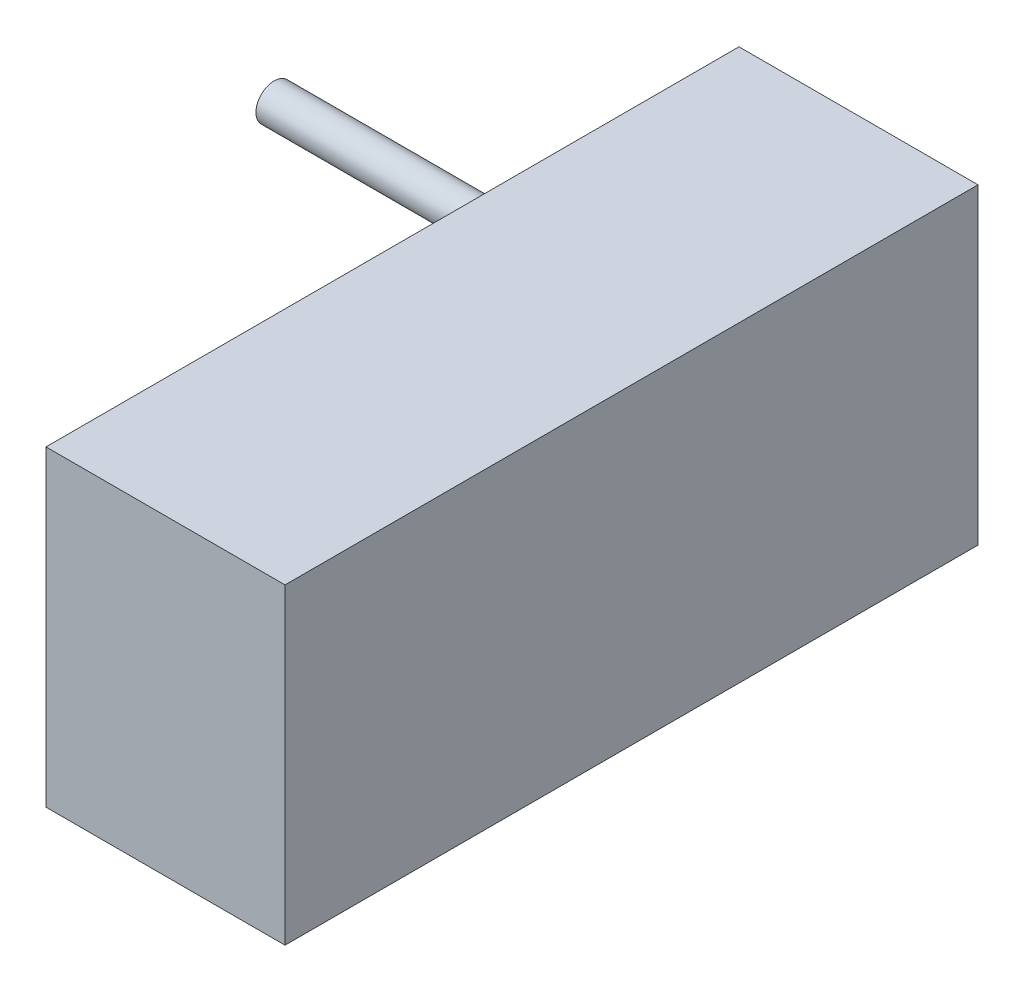
ISO-10303-21;
HEADER;
FILE_DESCRIPTION(('STEP AP214'),'2;1');
FILE_NAME('part.step','',(''),(''),'','','');
FILE_SCHEMA(('AUTOMOTIVE_DESIGN { 1 0 10303 214 1 1 1 1 }'));
ENDSEC;
DATA;
#1=APPLICATION_CONTEXT('core data for automotive mechanical design processes');
#2=APPLICATION_PROTOCOL_DEFINITION('international standard','automotive_design',2000,#1);
#3=PRODUCT_CONTEXT('',#1,'mechanical');
#4=PRODUCT('Part','Part','',(#3));
#5=PRODUCT_RELATED_PRODUCT_CATEGORY('part','',(#4));
#6=PRODUCT_DEFINITION_FORMATION('','',#4);
#7=PRODUCT_DEFINITION_CONTEXT('part definition',#1,'design');
#8=PRODUCT_DEFINITION('design','',#6,#7);
#9=PRODUCT_DEFINITION_SHAPE('','',#8);
#10=(LENGTH_UNIT() NAMED_UNIT(*) SI_UNIT(.MILLI.,.METRE.));
#11=(NAMED_UNIT(*) PLANE_ANGLE_UNIT() SI_UNIT($,.RADIAN.));
#12=(NAMED_UNIT(*) SI_UNIT($,.STERADIAN.) SOLID_ANGLE_UNIT());
#13=UNCERTAINTY_MEASURE_WITH_UNIT(LENGTH_MEASURE(1.E-05),#10,'distance_accuracy_value','');
#14=(GEOMETRIC_REPRESENTATION_CONTEXT(3) GLOBAL_UNCERTAINTY_ASSIGNED_CONTEXT((#13)) GLOBAL_UNIT_ASSIGNED_CONTEXT((#10,
#11,#12)) REPRESENTATION_CONTEXT('',''));
#15=CARTESIAN_POINT('',(0.,0.,0.));
#16=DIRECTION('',(0.,0.,1.));
#17=DIRECTION('',(1.,0.,0.));
#18=AXIS2_PLACEMENT_3D('',#15,#16,#17);
#19=CARTESIAN_POINT('',(0.,25.,0.));
#20=DIRECTION('',(0.,0.,-1.));
#21=DIRECTION('',(-1.,0.,0.));
#22=AXIS2_PLACEMENT_3D('',#19,#20,#21);
#23=PLANE('',#22);
#24=DIRECTION('',(1.,0.,0.));
#25=VECTOR('',#24,1.);
#26=CARTESIAN_POINT('',(0.,0.,0.));
#27=LINE('',#26,#25);
#28=CARTESIAN_POINT('',(0.,0.,0.));
#29=VERTEX_POINT('',#28);
#30=CARTESIAN_POINT('',(19.15,0.,0.));
#31=VERTEX_POINT('',#30);
#32=EDGE_CURVE('E103',#29,#31,#27,.T.);
#33=ORIENTED_EDGE('',*,*,#32,.T.);
#34=DIRECTION('',(0.,-1.,0.));
#35=VECTOR('',#34,1.);
#36=CARTESIAN_POINT('',(19.15,25.,0.));
#37=LINE('',#36,#35);
#38=CARTESIAN_POINT('',(19.15,25.,0.));
#39=VERTEX_POINT('',#38);
#40=EDGE_CURVE('E45',#39,#31,#37,.T.);
#41=ORIENTED_EDGE('',*,*,#40,.F.);
#42=DIRECTION('',(1.,0.,0.));
#43=VECTOR('',#42,1.);
#44=CARTESIAN_POINT('',(0.,25.,0.));
#45=LINE('',#44,#43);
#46=CARTESIAN_POINT('',(0.,25.,0.));
#47=VERTEX_POINT('',#46);
#48=EDGE_CURVE('E78',#47,#39,#45,.T.);
#49=ORIENTED_EDGE('',*,*,#48,.F.);
#50=DIRECTION('',(0.,-1.,0.));
#51=VECTOR('',#50,1.);
#52=CARTESIAN_POINT('',(0.,25.,0.));
#53=LINE('',#52,#51);
#54=EDGE_CURVE('E53',#47,#29,#53,.T.);
#55=ORIENTED_EDGE('',*,*,#54,.T.);
#56=EDGE_LOOP('',(#33,#41,#49,#55));
#57=FACE_BOUND('',#56,.T.);
#58=ADVANCED_FACE('F37',(#57),#23,.F.);
#59=CARTESIAN_POINT('',(19.15,25.,-55.52));
#60=DIRECTION('',(1.,0.,0.));
#61=DIRECTION('',(0.,0.,-1.));
#62=AXIS2_PLACEMENT_3D('',#59,#60,#61);
#63=PLANE('',#62);
#64=DIRECTION('',(0.,0.,1.));
#65=VECTOR('',#64,1.);
#66=CARTESIAN_POINT('',(19.15,0.,-55.52));
#67=LINE('',#66,#65);
#68=CARTESIAN_POINT('',(19.15,0.,-55.52));
#69=VERTEX_POINT('',#68);
#70=EDGE_CURVE('E88',#69,#31,#67,.T.);
#71=ORIENTED_EDGE('',*,*,#70,.F.);
#72=DIRECTION('',(0.,-1.,0.));
#73=VECTOR('',#72,1.);
#74=CARTESIAN_POINT('',(19.15,25.,-55.52));
#75=LINE('',#74,#73);
#76=CARTESIAN_POINT('',(19.15,25.,-55.52));
#77=VERTEX_POINT('',#76);
#78=EDGE_CURVE('E84',#77,#69,#75,.T.);
#79=ORIENTED_EDGE('',*,*,#78,.F.);
#80=DIRECTION('',(0.,0.,1.));
#81=VECTOR('',#80,1.);
#82=CARTESIAN_POINT('',(19.15,25.,-55.52));
#83=LINE('',#82,#81);
#84=EDGE_CURVE('E86',#77,#39,#83,.T.);
#85=ORIENTED_EDGE('',*,*,#84,.T.);
#86=ORIENTED_EDGE('',*,*,#40,.T.);
#87=EDGE_LOOP('',(#71,#79,#85,#86));
#88=FACE_BOUND('',#87,.T.);
#89=ADVANCED_FACE('F85',(#88),#63,.T.);
#90=CARTESIAN_POINT('',(0.,25.,-55.52));
#91=DIRECTION('',(0.,0.,-1.));
#92=DIRECTION('',(-1.,0.,0.));
#93=AXIS2_PLACEMENT_3D('',#90,#91,#92);
#94=PLANE('',#93);
#95=DIRECTION('',(1.,0.,0.));
#96=VECTOR('',#95,1.);
#97=CARTESIAN_POINT('',(0.,0.,-55.52));
#98=LINE('',#97,#96);
#99=CARTESIAN_POINT('',(0.,0.,-55.52));
#100=VERTEX_POINT('',#99);
#101=EDGE_CURVE('E107',#100,#69,#98,.T.);
#102=ORIENTED_EDGE('',*,*,#101,.F.);
#103=DIRECTION('',(0.,-1.,0.));
#104=VECTOR('',#103,1.);
#105=CARTESIAN_POINT('',(0.,25.,-55.52));
#106=LINE('',#105,#104);
#107=CARTESIAN_POINT('',(0.,25.,-55.52));
#108=VERTEX_POINT('',#107);
#109=EDGE_CURVE('E67',#108,#100,#106,.T.);
#110=ORIENTED_EDGE('',*,*,#109,.F.);
#111=DIRECTION('',(1.,0.,0.));
#112=VECTOR('',#111,1.);
#113=CARTESIAN_POINT('',(0.,25.,-55.52));
#114=LINE('',#113,#112);
#115=EDGE_CURVE('E95',#108,#77,#114,.T.);
#116=ORIENTED_EDGE('',*,*,#115,.T.);
#117=ORIENTED_EDGE('',*,*,#78,.T.);
#118=EDGE_LOOP('',(#102,#110,#116,#117));
#119=FACE_BOUND('',#118,.T.);
#120=ADVANCED_FACE('F97',(#119),#94,.T.);
#121=CARTESIAN_POINT('',(0.,25.,0.));
#122=DIRECTION('',(-1.,0.,0.));
#123=DIRECTION('',(0.,0.,1.));
#124=AXIS2_PLACEMENT_3D('',#121,#122,#123);
#125=PLANE('',#124);
#126=CARTESIAN_POINT('',(0.,12.5,-45.58));
#127=DIRECTION('',(-1.,0.,0.));
#128=DIRECTION('',(0.,0.,1.));
#129=AXIS2_PLACEMENT_3D('',#126,#127,#128);
#130=CIRCLE('',#129,1.46);
#131=CARTESIAN_POINT('',(0.,12.5,-44.12));
#132=VERTEX_POINT('',#131);
#133=EDGE_CURVE('E11',#132,#132,#130,.T.);
#134=ORIENTED_EDGE('',*,*,#133,.F.);
#135=EDGE_LOOP('',(#134));
#136=FACE_BOUND('',#135,.T.);
#137=DIRECTION('',(0.,0.,-1.));
#138=VECTOR('',#137,1.);
#139=CARTESIAN_POINT('',(0.,0.,0.));
#140=LINE('',#139,#138);
#141=EDGE_CURVE('E109',#29,#100,#140,.T.);
#142=ORIENTED_EDGE('',*,*,#141,.F.);
#143=ORIENTED_EDGE('',*,*,#54,.F.);
#144=DIRECTION('',(0.,0.,-1.));
#145=VECTOR('',#144,1.);
#146=CARTESIAN_POINT('',(0.,25.,0.));
#147=LINE('',#146,#145);
#148=EDGE_CURVE('E98',#47,#108,#147,.T.);
#149=ORIENTED_EDGE('',*,*,#148,.T.);
#150=ORIENTED_EDGE('',*,*,#109,.T.);
#151=EDGE_LOOP('',(#142,#143,#149,#150));
#152=FACE_BOUND('',#151,.T.);
#153=ADVANCED_FACE('F115',(#136,#152),#125,.T.);
#154=CARTESIAN_POINT('',(0.,25.,0.));
#155=DIRECTION('',(0.,-1.,0.));
#156=DIRECTION('',(0.,0.,-1.));
#157=AXIS2_PLACEMENT_3D('',#154,#155,#156);
#158=PLANE('',#157);
#159=ORIENTED_EDGE('',*,*,#48,.T.);
#160=ORIENTED_EDGE('',*,*,#84,.F.);
#161=ORIENTED_EDGE('',*,*,#115,.F.);
#162=ORIENTED_EDGE('',*,*,#148,.F.);
#163=EDGE_LOOP('',(#159,#160,#161,#162));
#164=FACE_BOUND('',#163,.T.);
#165=ADVANCED_FACE('F94',(#164),#158,.F.);
#166=CARTESIAN_POINT('',(0.,0.,0.));
#167=DIRECTION('',(0.,-1.,0.));
#168=DIRECTION('',(0.,0.,-1.));
#169=AXIS2_PLACEMENT_3D('',#166,#167,#168);
#170=PLANE('',#169);
#171=ORIENTED_EDGE('',*,*,#32,.F.);
#172=ORIENTED_EDGE('',*,*,#141,.T.);
#173=ORIENTED_EDGE('',*,*,#101,.T.);
#174=ORIENTED_EDGE('',*,*,#70,.T.);
#175=EDGE_LOOP('',(#171,#172,#173,#174));
#176=FACE_BOUND('',#175,.T.);
#177=ADVANCED_FACE('F114',(#176),#170,.T.);
#178=CARTESIAN_POINT('',(-27.3,12.5,-45.58));
#179=DIRECTION('',(1.,0.,0.));
#180=DIRECTION('',(0.,0.,-1.));
#181=AXIS2_PLACEMENT_3D('',#178,#179,#180);
#182=CYLINDRICAL_SURFACE('',#181,1.46);
#183=CARTESIAN_POINT('',(-27.3,12.5,-45.58));
#184=DIRECTION('',(1.,0.,0.));
#185=DIRECTION('',(0.,0.,-1.));
#186=AXIS2_PLACEMENT_3D('',#183,#184,#185);
#187=CIRCLE('',#186,1.46);
#188=CARTESIAN_POINT('',(-27.3,12.5,-47.04));
#189=VERTEX_POINT('',#188);
#190=EDGE_CURVE('E105',#189,#189,#187,.T.);
#191=ORIENTED_EDGE('',*,*,#190,.T.);
#192=EDGE_LOOP('',(#191));
#193=FACE_BOUND('',#192,.T.);
#194=ORIENTED_EDGE('',*,*,#133,.T.);
#195=EDGE_LOOP('',(#194));
#196=FACE_BOUND('',#195,.T.);
#197=ADVANCED_FACE('F147',(#193,#196),#182,.T.);
#198=CARTESIAN_POINT('',(-27.3,12.5,-45.58));
#199=DIRECTION('',(1.,0.,0.));
#200=DIRECTION('',(0.,0.,-1.));
#201=AXIS2_PLACEMENT_3D('',#198,#199,#200);
#202=PLANE('',#201);
#203=ORIENTED_EDGE('',*,*,#190,.F.);
#204=EDGE_LOOP('',(#203));
#205=FACE_BOUND('',#204,.T.);
#206=ADVANCED_FACE('F154',(#205),#202,.F.);
#207=CLOSED_SHELL('',(#58,#89,#120,#153,#165,#177,#197,#206));
#208=MANIFOLD_SOLID_BREP('B2',#207);
#209=ADVANCED_BREP_SHAPE_REPRESENTATION('',(#18,#208),#14);
#210=SHAPE_DEFINITION_REPRESENTATION(#9,#209);
ENDSEC;
END-ISO-10303-21;
